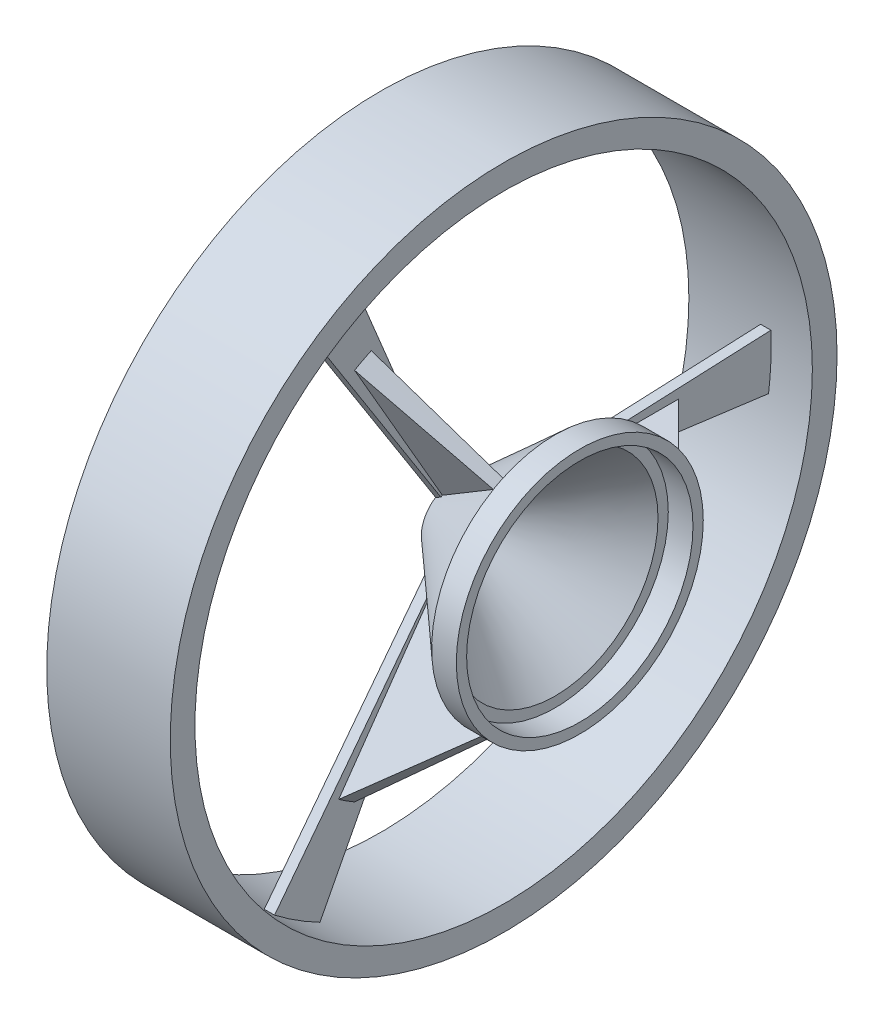
ISO-10303-21;
HEADER;
FILE_DESCRIPTION(('STEP AP214'),'2;1');
FILE_NAME('part.step','',(''),(''),'','','');
FILE_SCHEMA(('AUTOMOTIVE_DESIGN { 1 0 10303 214 1 1 1 1 }'));
ENDSEC;
DATA;
#1=APPLICATION_CONTEXT('core data for automotive mechanical design processes');
#2=APPLICATION_PROTOCOL_DEFINITION('international standard','automotive_design',2000,#1);
#3=PRODUCT_CONTEXT('',#1,'mechanical');
#4=PRODUCT('Part','Part','',(#3));
#5=PRODUCT_RELATED_PRODUCT_CATEGORY('part','',(#4));
#6=PRODUCT_DEFINITION_FORMATION('','',#4);
#7=PRODUCT_DEFINITION_CONTEXT('part definition',#1,'design');
#8=PRODUCT_DEFINITION('design','',#6,#7);
#9=PRODUCT_DEFINITION_SHAPE('','',#8);
#10=(LENGTH_UNIT() NAMED_UNIT(*) SI_UNIT(.MILLI.,.METRE.));
#11=(NAMED_UNIT(*) PLANE_ANGLE_UNIT() SI_UNIT($,.RADIAN.));
#12=(NAMED_UNIT(*) SI_UNIT($,.STERADIAN.) SOLID_ANGLE_UNIT());
#13=UNCERTAINTY_MEASURE_WITH_UNIT(LENGTH_MEASURE(1.E-05),#10,'distance_accuracy_value','');
#14=(GEOMETRIC_REPRESENTATION_CONTEXT(3) GLOBAL_UNCERTAINTY_ASSIGNED_CONTEXT((#13)) GLOBAL_UNIT_ASSIGNED_CONTEXT((#10,
#11,#12)) REPRESENTATION_CONTEXT('',''));
#15=CARTESIAN_POINT('',(0.,0.,0.));
#16=DIRECTION('',(0.,0.,1.));
#17=DIRECTION('',(1.,0.,0.));
#18=AXIS2_PLACEMENT_3D('',#15,#16,#17);
#19=CARTESIAN_POINT('',(-6.00000000000001,0.,2.22044604925031E-13));
#20=DIRECTION('',(1.,0.,0.));
#21=DIRECTION('',(0.,0.,-1.));
#22=AXIS2_PLACEMENT_3D('',#19,#20,#21);
#23=CONICAL_SURFACE('',#22,30.0000000000003,0.732815101786509);
#24=CARTESIAN_POINT('',(-31.,0.,2.22044604925031E-13));
#25=DIRECTION('',(-1.,0.,0.));
#26=DIRECTION('',(0.,0.,1.));
#27=AXIS2_PLACEMENT_3D('',#24,#25,#26);
#28=CIRCLE('',#27,7.50000000000019);
#29=CARTESIAN_POINT('',(-31.,6.92909649383467,2.87012574273806));
#30=VERTEX_POINT('',#29);
#31=CARTESIAN_POINT('',(-31.,0.327145405240019,-7.4928616618639));
#32=VERTEX_POINT('',#31);
#33=EDGE_CURVE('E251',#30,#32,#28,.T.);
#34=ORIENTED_EDGE('',*,*,#33,.F.);
#35=DIRECTION('',(0.743294146247166,0.61804282351789,0.256001719628465));
#36=VECTOR('',#35,1.);
#37=CARTESIAN_POINT('',(-31.,6.92909649383467,2.87012574273806));
#38=LINE('',#37,#36);
#39=CARTESIAN_POINT('',(-28.5,9.00782544198507,3.73116346555949));
#40=VERTEX_POINT('',#39);
#41=EDGE_CURVE('E392',#30,#40,#38,.T.);
#42=ORIENTED_EDGE('',*,*,#41,.T.);
#43=CARTESIAN_POINT('',(-28.5,-1.92296268638357E-13,-1.11022302462514E-13));
#44=DIRECTION('',(1.,0.,0.));
#45=DIRECTION('',(0.,0.866025403784443,0.499999999999992));
#46=AXIS2_PLACEMENT_3D('',#43,#44,#45);
#47=CIRCLE('',#46,9.75000000000019);
#48=CARTESIAN_POINT('',(-28.5,8.83650092360735,4.12052805197172));
#49=VERTEX_POINT('',#48);
#50=EDGE_CURVE('E359',#40,#49,#47,.T.);
#51=ORIENTED_EDGE('',*,*,#50,.T.);
#52=DIRECTION('',(0.743294146247165,0.606287945522313,0.282716712044108));
#53=VECTOR('',#52,1.);
#54=CARTESIAN_POINT('',(-6.,27.1892336110997,12.6785478522208));
#55=LINE('',#54,#53);
#56=CARTESIAN_POINT('',(-6.,27.1892336110997,12.6785478522208));
#57=VERTEX_POINT('',#56);
#58=EDGE_CURVE('E54',#49,#57,#55,.T.);
#59=ORIENTED_EDGE('',*,*,#58,.T.);
#60=CARTESIAN_POINT('',(-6.,-4.85722573273506E-13,2.22044604925031E-13));
#61=DIRECTION('',(-1.,0.,0.));
#62=DIRECTION('',(0.,0.,1.));
#63=AXIS2_PLACEMENT_3D('',#60,#61,#62);
#64=CIRCLE('',#63,30.0000000000003);
#65=CARTESIAN_POINT('',(-6.,0.,-30.0000000000001));
#66=VERTEX_POINT('',#65);
#67=EDGE_CURVE('E61',#57,#66,#64,.T.);
#68=ORIENTED_EDGE('',*,*,#67,.T.);
#69=DIRECTION('',(0.743294146247165,0.,-0.668964731622451));
#70=VECTOR('',#69,1.);
#71=CARTESIAN_POINT('',(-6.,0.,-30.0000000000001));
#72=LINE('',#71,#70);
#73=CARTESIAN_POINT('',(-28.5,0.,-9.74999999999997));
#74=VERTEX_POINT('',#73);
#75=EDGE_CURVE('E459',#74,#66,#72,.T.);
#76=ORIENTED_EDGE('',*,*,#75,.F.);
#77=CARTESIAN_POINT('',(-28.5,0.,2.22044604925031E-13));
#78=DIRECTION('',(1.,0.,0.));
#79=DIRECTION('',(0.,0.,-1.));
#80=AXIS2_PLACEMENT_3D('',#77,#78,#79);
#81=CIRCLE('',#80,9.75000000000019);
#82=CARTESIAN_POINT('',(-28.5,0.425289026812025,-9.74072016042308));
#83=VERTEX_POINT('',#82);
#84=EDGE_CURVE('E212',#74,#83,#81,.T.);
#85=ORIENTED_EDGE('',*,*,#84,.T.);
#86=DIRECTION('',(0.743294146247166,0.0291798317623878,-0.668328025428394));
#87=VECTOR('',#86,1.);
#88=CARTESIAN_POINT('',(-31.,0.32714540524002,-7.49286166186391));
#89=LINE('',#88,#87);
#90=EDGE_CURVE('E217',#32,#83,#89,.T.);
#91=ORIENTED_EDGE('',*,*,#90,.F.);
#92=EDGE_LOOP('',(#34,#42,#51,#59,#68,#76,#85,#91));
#93=FACE_BOUND('',#92,.T.);
#94=ADVANCED_FACE('F45',(#93),#23,.T.);
#95=CARTESIAN_POINT('',(-6.,0.,0.));
#96=DIRECTION('',(-1.,0.,0.));
#97=DIRECTION('',(0.,-0.866025403784443,-0.499999999999992));
#98=AXIS2_PLACEMENT_3D('',#95,#96,#97);
#99=CONICAL_SURFACE('',#98,30.0000000000001,0.783748034172808);
#100=DIRECTION('',(-0.708272635521935,0.639798014188676,0.298342713688533));
#101=VECTOR('',#100,1.);
#102=CARTESIAN_POINT('',(-31.,49.7722751582718,23.2091930700994));
#103=LINE('',#102,#101);
#104=CARTESIAN_POINT('',(-28.5,47.5139710035546,22.1561285483115));
#105=VERTEX_POINT('',#104);
#106=EDGE_CURVE('E418',#57,#105,#103,.T.);
#107=ORIENTED_EDGE('',*,*,#106,.T.);
#108=CARTESIAN_POINT('',(-28.5,0.,0.));
#109=DIRECTION('',(1.,0.,0.));
#110=DIRECTION('',(0.,0.866025403784443,0.499999999999992));
#111=AXIS2_PLACEMENT_3D('',#108,#109,#110);
#112=CIRCLE('',#111,52.425866447546);
#113=CARTESIAN_POINT('',(-28.5,45.4021321589853,26.2129332237726));
#114=VERTEX_POINT('',#113);
#115=EDGE_CURVE('E353',#105,#114,#112,.T.);
#116=ORIENTED_EDGE('',*,*,#115,.T.);
#117=DIRECTION('',(-0.708272635521935,0.611361108779511,0.352969500725911));
#118=VECTOR('',#117,1.);
#119=CARTESIAN_POINT('',(-31.,47.5600621640355,27.4588146930807));
#120=LINE('',#119,#118);
#121=CARTESIAN_POINT('',(-6.,25.9807621135334,14.9999999999998));
#122=VERTEX_POINT('',#121);
#123=EDGE_CURVE('E410',#122,#114,#120,.T.);
#124=ORIENTED_EDGE('',*,*,#123,.F.);
#125=CARTESIAN_POINT('',(-6.,0.,-5.31670390108921E-13));
#126=DIRECTION('',(-1.,0.,0.));
#127=DIRECTION('',(0.,-0.866025403784443,-0.499999999999992));
#128=AXIS2_PLACEMENT_3D('',#125,#126,#127);
#129=CIRCLE('',#128,30.0000000000003);
#130=EDGE_CURVE('E11',#122,#57,#129,.T.);
#131=ORIENTED_EDGE('',*,*,#130,.T.);
#132=EDGE_LOOP('',(#107,#116,#124,#131));
#133=FACE_BOUND('',#132,.T.);
#134=ADVANCED_FACE('F47',(#133),#99,.T.);
#135=CARTESIAN_POINT('',(0.,0.,0.));
#136=DIRECTION('',(0.,-0.422618261740691,0.906307787036654));
#137=DIRECTION('',(0.,-0.906307787036654,-0.422618261740691));
#138=AXIS2_PLACEMENT_3D('',#135,#136,#137);
#139=PLANE('',#138);
#140=DIRECTION('',(0.,-0.906307787036654,-0.422618261740691));
#141=VECTOR('',#140,1.);
#142=CARTESIAN_POINT('',(-28.5,8.82809053273636,4.11660622230051));
#143=LINE('',#142,#141);
#144=EDGE_CURVE('E356',#105,#49,#143,.T.);
#145=ORIENTED_EDGE('',*,*,#144,.F.);
#146=ORIENTED_EDGE('',*,*,#106,.F.);
#147=ORIENTED_EDGE('',*,*,#58,.F.);
#148=EDGE_LOOP('',(#145,#146,#147));
#149=FACE_BOUND('',#148,.T.);
#150=ADVANCED_FACE('F506',(#149),#139,.F.);
#151=CARTESIAN_POINT('',(0.,0.,0.));
#152=DIRECTION('',(0.,-0.499999999999992,0.866025403784443));
#153=DIRECTION('',(0.,-0.866025403784443,-0.499999999999992));
#154=AXIS2_PLACEMENT_3D('',#151,#152,#153);
#155=PLANE('',#154);
#156=ORIENTED_EDGE('',*,*,#123,.T.);
#157=DIRECTION('',(0.,-0.866025403784443,-0.499999999999992));
#158=VECTOR('',#157,1.);
#159=CARTESIAN_POINT('',(-28.5,8.37151025491231,4.83329369919723));
#160=LINE('',#159,#158);
#161=CARTESIAN_POINT('',(-28.5,8.4437476868983,4.87499999999991));
#162=VERTEX_POINT('',#161);
#163=EDGE_CURVE('E376',#114,#162,#160,.T.);
#164=ORIENTED_EDGE('',*,*,#163,.T.);
#165=DIRECTION('',(0.743294146247165,0.579340451820885,0.33448236581122));
#166=VECTOR('',#165,1.);
#167=CARTESIAN_POINT('',(-6.,25.9807621135334,14.9999999999998));
#168=LINE('',#167,#166);
#169=EDGE_CURVE('E414',#162,#122,#168,.T.);
#170=ORIENTED_EDGE('',*,*,#169,.T.);
#171=EDGE_LOOP('',(#156,#164,#170));
#172=FACE_BOUND('',#171,.T.);
#173=ADVANCED_FACE('F557',(#172),#155,.T.);
#174=CARTESIAN_POINT('',(-31.,69.2909649383468,28.701257427381));
#175=DIRECTION('',(-1.,0.,0.));
#176=DIRECTION('',(0.,-0.866025403784443,-0.499999999999992));
#177=AXIS2_PLACEMENT_3D('',#174,#175,#176);
#178=PLANE('',#177);
#179=DIRECTION('',(0.,-0.923879532511291,-0.382683432365081));
#180=VECTOR('',#179,1.);
#181=CARTESIAN_POINT('',(-31.,69.2909649383468,28.701257427381));
#182=LINE('',#181,#180);
#183=CARTESIAN_POINT('',(-31.,69.2909649383469,28.7012574273811));
#184=VERTEX_POINT('',#183);
#185=EDGE_CURVE('E396',#184,#30,#182,.T.);
#186=ORIENTED_EDGE('',*,*,#185,.T.);
#187=CARTESIAN_POINT('',(-31.,-1.92296268638357E-13,-1.11022302462514E-13));
#188=DIRECTION('',(-1.,0.,0.));
#189=DIRECTION('',(0.,-0.866025403784443,-0.499999999999992));
#190=AXIS2_PLACEMENT_3D('',#187,#188,#189);
#191=CIRCLE('',#190,7.50000000000019);
#192=CARTESIAN_POINT('',(-31.,6.32543584359665,4.0297470626011));
#193=VERTEX_POINT('',#192);
#194=EDGE_CURVE('E403',#193,#30,#191,.T.);
#195=ORIENTED_EDGE('',*,*,#194,.F.);
#196=DIRECTION('',(0.,-0.843391445812891,-0.537299608346816));
#197=VECTOR('',#196,1.);
#198=CARTESIAN_POINT('',(-31.,63.2543584359668,40.2974706260112));
#199=LINE('',#198,#197);
#200=CARTESIAN_POINT('',(-31.,63.2543584359669,40.2974706260113));
#201=VERTEX_POINT('',#200);
#202=EDGE_CURVE('E388',#201,#193,#199,.T.);
#203=ORIENTED_EDGE('',*,*,#202,.F.);
#204=CARTESIAN_POINT('',(-31.,-1.92296268638357E-13,-1.11022302462514E-13));
#205=DIRECTION('',(1.,0.,0.));
#206=DIRECTION('',(0.,0.866025403784443,0.499999999999992));
#207=AXIS2_PLACEMENT_3D('',#204,#205,#206);
#208=CIRCLE('',#207,75.0000000000002);
#209=EDGE_CURVE('E407',#184,#201,#208,.T.);
#210=ORIENTED_EDGE('',*,*,#209,.F.);
#211=EDGE_LOOP('',(#186,#195,#203,#210));
#212=FACE_BOUND('',#211,.T.);
#213=ADVANCED_FACE('F553',(#212),#178,.T.);
#214=CARTESIAN_POINT('',(0.,0.,0.));
#215=DIRECTION('',(0.,-0.382683432365081,0.92387953251129));
#216=DIRECTION('',(0.,-0.923879532511291,-0.382683432365081));
#217=AXIS2_PLACEMENT_3D('',#214,#215,#216);
#218=PLANE('',#217);
#219=ORIENTED_EDGE('',*,*,#41,.F.);
#220=ORIENTED_EDGE('',*,*,#185,.F.);
#221=DIRECTION('',(-1.,0.,0.));
#222=VECTOR('',#221,1.);
#223=CARTESIAN_POINT('',(-28.5,69.2909649383468,28.701257427381));
#224=LINE('',#223,#222);
#225=CARTESIAN_POINT('',(-28.5,69.2909649383469,28.7012574273811));
#226=VERTEX_POINT('',#225);
#227=EDGE_CURVE('E400',#226,#184,#224,.T.);
#228=ORIENTED_EDGE('',*,*,#227,.F.);
#229=DIRECTION('',(0.,0.923879532511291,0.382683432365081));
#230=VECTOR('',#229,1.);
#231=CARTESIAN_POINT('',(-28.5,9.00782544198507,3.73116346555949));
#232=LINE('',#231,#230);
#233=EDGE_CURVE('E363',#40,#226,#232,.T.);
#234=ORIENTED_EDGE('',*,*,#233,.F.);
#235=EDGE_LOOP('',(#219,#220,#228,#234));
#236=FACE_BOUND('',#235,.T.);
#237=ADVANCED_FACE('F549',(#236),#218,.F.);
#238=CARTESIAN_POINT('',(0.,0.,0.));
#239=DIRECTION('',(0.,-0.537299608346816,0.84339144581289));
#240=DIRECTION('',(0.,-0.843391445812891,-0.537299608346816));
#241=AXIS2_PLACEMENT_3D('',#238,#239,#240);
#242=PLANE('',#241);
#243=DIRECTION('',(0.743294146247166,0.564199132200891,0.359434488298575));
#244=VECTOR('',#243,1.);
#245=CARTESIAN_POINT('',(-31.,6.32543584359666,4.02974706260111));
#246=LINE('',#245,#244);
#247=CARTESIAN_POINT('',(-28.5,8.22306659667565,5.23867118138144));
#248=VERTEX_POINT('',#247);
#249=EDGE_CURVE('E380',#193,#248,#246,.T.);
#250=ORIENTED_EDGE('',*,*,#249,.T.);
#251=DIRECTION('',(0.,0.843391445812891,0.537299608346816));
#252=VECTOR('',#251,1.);
#253=CARTESIAN_POINT('',(-28.5,8.22306659667565,5.23867118138144));
#254=LINE('',#253,#252);
#255=CARTESIAN_POINT('',(-28.5,63.2543584359668,40.2974706260112));
#256=VERTEX_POINT('',#255);
#257=EDGE_CURVE('E372',#248,#256,#254,.T.);
#258=ORIENTED_EDGE('',*,*,#257,.T.);
#259=DIRECTION('',(-1.,0.,0.));
#260=VECTOR('',#259,1.);
#261=CARTESIAN_POINT('',(-28.5,63.2543584359668,40.2974706260112));
#262=LINE('',#261,#260);
#263=EDGE_CURVE('E384',#256,#201,#262,.T.);
#264=ORIENTED_EDGE('',*,*,#263,.T.);
#265=ORIENTED_EDGE('',*,*,#202,.T.);
#266=EDGE_LOOP('',(#250,#258,#264,#265));
#267=FACE_BOUND('',#266,.T.);
#268=ADVANCED_FACE('F545',(#267),#242,.T.);
#269=CARTESIAN_POINT('',(-28.5,9.00782544198507,3.73116346555949));
#270=DIRECTION('',(1.,0.,0.));
#271=DIRECTION('',(0.,0.866025403784443,0.499999999999992));
#272=AXIS2_PLACEMENT_3D('',#269,#270,#271);
#273=PLANE('',#272);
#274=ORIENTED_EDGE('',*,*,#115,.F.);
#275=ORIENTED_EDGE('',*,*,#144,.T.);
#276=ORIENTED_EDGE('',*,*,#50,.F.);
#277=ORIENTED_EDGE('',*,*,#233,.T.);
#278=CARTESIAN_POINT('',(-28.5,-1.92296268638357E-13,-1.11022302462514E-13));
#279=DIRECTION('',(1.,0.,0.));
#280=DIRECTION('',(0.,0.866025403784443,0.499999999999992));
#281=AXIS2_PLACEMENT_3D('',#278,#279,#280);
#282=CIRCLE('',#281,75.0000000000002);
#283=EDGE_CURVE('E368',#226,#256,#282,.T.);
#284=ORIENTED_EDGE('',*,*,#283,.T.);
#285=ORIENTED_EDGE('',*,*,#257,.F.);
#286=EDGE_CURVE('E364',#162,#248,#47,.T.);
#287=ORIENTED_EDGE('',*,*,#286,.F.);
#288=ORIENTED_EDGE('',*,*,#163,.F.);
#289=EDGE_LOOP('',(#274,#275,#276,#277,#284,#285,#287,#288));
#290=FACE_BOUND('',#289,.T.);
#291=ADVANCED_FACE('F510',(#290),#273,.T.);
#292=CARTESIAN_POINT('',(-31.,-5.9501500521842,4.56571071756545));
#293=VERTEX_POINT('',#292);
#294=EDGE_CURVE('E272',#293,#193,#28,.T.);
#295=ORIENTED_EDGE('',*,*,#294,.F.);
#296=DIRECTION('',(0.743294146247166,-0.530725404369699,0.407239925978921));
#297=VECTOR('',#296,1.);
#298=CARTESIAN_POINT('',(-31.,-5.9501500521842,4.56571071756545));
#299=LINE('',#298,#297);
#300=CARTESIAN_POINT('',(-28.5,-7.73519506783947,5.93542393283508));
#301=VERTEX_POINT('',#300);
#302=EDGE_CURVE('E316',#293,#301,#299,.T.);
#303=ORIENTED_EDGE('',*,*,#302,.T.);
#304=CARTESIAN_POINT('',(-28.5,1.92296268638356E-13,-1.11022302462517E-13));
#305=DIRECTION('',(1.,0.,0.));
#306=DIRECTION('',(0.,-0.866025403784436,0.500000000000004));
#307=AXIS2_PLACEMENT_3D('',#304,#305,#306);
#308=CIRCLE('',#307,9.75000000000019);
#309=CARTESIAN_POINT('',(-28.5,-7.98673243181762,5.59237025442272));
#310=VERTEX_POINT('',#309);
#311=EDGE_CURVE('E283',#301,#310,#308,.T.);
#312=ORIENTED_EDGE('',*,*,#311,.T.);
#313=DIRECTION('',(0.743294146247165,-0.547983827465766,0.383702406808542));
#314=VECTOR('',#313,1.);
#315=CARTESIAN_POINT('',(-6.,-24.5745613286697,17.2072930905316));
#316=LINE('',#315,#314);
#317=CARTESIAN_POINT('',(-6.,-24.5745613286698,17.2072930905316));
#318=VERTEX_POINT('',#317);
#319=EDGE_CURVE('E346',#310,#318,#316,.T.);
#320=ORIENTED_EDGE('',*,*,#319,.T.);
#321=EDGE_CURVE('E69',#318,#122,#64,.T.);
#322=ORIENTED_EDGE('',*,*,#321,.T.);
#323=ORIENTED_EDGE('',*,*,#169,.F.);
#324=ORIENTED_EDGE('',*,*,#286,.T.);
#325=ORIENTED_EDGE('',*,*,#249,.F.);
#326=EDGE_LOOP('',(#295,#303,#312,#320,#322,#323,#324,#325));
#327=FACE_BOUND('',#326,.T.);
#328=ADVANCED_FACE('F440',(#327),#23,.T.);
#329=CARTESIAN_POINT('',(-6.,0.,0.));
#330=DIRECTION('',(-1.,0.,0.));
#331=DIRECTION('',(0.,0.866025403784436,-0.500000000000004));
#332=AXIS2_PLACEMENT_3D('',#329,#330,#331);
#333=CONICAL_SURFACE('',#332,30.0000000000001,0.783748034172808);
#334=DIRECTION('',(-0.708272635521935,-0.578271376182597,0.404909976733962));
#335=VECTOR('',#334,1.);
#336=CARTESIAN_POINT('',(-31.,-44.9858883791798,31.4994581561626));
#337=LINE('',#336,#335);
#338=CARTESIAN_POINT('',(-28.5,-42.9447556741288,30.0702416495995));
#339=VERTEX_POINT('',#338);
#340=EDGE_CURVE('E342',#318,#339,#337,.T.);
#341=ORIENTED_EDGE('',*,*,#340,.T.);
#342=CARTESIAN_POINT('',(-28.5,0.,0.));
#343=DIRECTION('',(1.,0.,0.));
#344=DIRECTION('',(0.,-0.866025403784436,0.500000000000004));
#345=AXIS2_PLACEMENT_3D('',#342,#343,#344);
#346=CIRCLE('',#345,52.425866447546);
#347=CARTESIAN_POINT('',(-28.5,-45.402132158985,26.2129332237732));
#348=VERTEX_POINT('',#347);
#349=EDGE_CURVE('E277',#339,#348,#346,.T.);
#350=ORIENTED_EDGE('',*,*,#349,.T.);
#351=DIRECTION('',(-0.708272635521935,-0.611361108779506,0.35296950072592));
#352=VECTOR('',#351,1.);
#353=CARTESIAN_POINT('',(-31.,-47.5600621640351,27.4588146930813));
#354=LINE('',#353,#352);
#355=CARTESIAN_POINT('',(-6.,-25.9807621135332,15.0000000000002));
#356=VERTEX_POINT('',#355);
#357=EDGE_CURVE('E334',#356,#348,#354,.T.);
#358=ORIENTED_EDGE('',*,*,#357,.F.);
#359=CARTESIAN_POINT('',(-6.,4.35157555275111E-13,3.09625785183887E-13));
#360=DIRECTION('',(-1.,0.,0.));
#361=DIRECTION('',(0.,0.866025403784436,-0.500000000000004));
#362=AXIS2_PLACEMENT_3D('',#359,#360,#361);
#363=CIRCLE('',#362,30.0000000000003);
#364=EDGE_CURVE('E349',#356,#318,#363,.T.);
#365=ORIENTED_EDGE('',*,*,#364,.T.);
#366=EDGE_LOOP('',(#341,#350,#358,#365));
#367=FACE_BOUND('',#366,.T.);
#368=ADVANCED_FACE('F442',(#367),#333,.T.);
#369=CARTESIAN_POINT('',(0.,0.,0.));
#370=DIRECTION('',(0.,-0.57357643635105,-0.819152044288989));
#371=DIRECTION('',(0.,0.819152044288989,-0.57357643635105));
#372=AXIS2_PLACEMENT_3D('',#369,#370,#371);
#373=PLANE('',#372);
#374=DIRECTION('',(0.,0.819152044288989,-0.57357643635105));
#375=VECTOR('',#374,1.);
#376=CARTESIAN_POINT('',(-28.5,-7.97913083225754,5.5870475571083));
#377=LINE('',#376,#375);
#378=EDGE_CURVE('E280',#339,#310,#377,.T.);
#379=ORIENTED_EDGE('',*,*,#378,.F.);
#380=ORIENTED_EDGE('',*,*,#340,.F.);
#381=ORIENTED_EDGE('',*,*,#319,.F.);
#382=EDGE_LOOP('',(#379,#380,#381));
#383=FACE_BOUND('',#382,.T.);
#384=ADVANCED_FACE('F438',(#383),#373,.F.);
#385=CARTESIAN_POINT('',(0.,0.,0.));
#386=DIRECTION('',(0.,-0.500000000000004,-0.866025403784436));
#387=DIRECTION('',(0.,0.866025403784436,-0.500000000000004));
#388=AXIS2_PLACEMENT_3D('',#385,#386,#387);
#389=PLANE('',#388);
#390=ORIENTED_EDGE('',*,*,#357,.T.);
#391=DIRECTION('',(0.,0.866025403784436,-0.500000000000004));
#392=VECTOR('',#391,1.);
#393=CARTESIAN_POINT('',(-28.5,-8.37151025491224,4.83329369919735));
#394=LINE('',#393,#392);
#395=CARTESIAN_POINT('',(-28.5,-8.44374768689823,4.87500000000002));
#396=VERTEX_POINT('',#395);
#397=EDGE_CURVE('E300',#348,#396,#394,.T.);
#398=ORIENTED_EDGE('',*,*,#397,.T.);
#399=DIRECTION('',(0.743294146247165,-0.579340451820881,0.334482365811228));
#400=VECTOR('',#399,1.);
#401=CARTESIAN_POINT('',(-6.,-25.9807621135332,15.0000000000002));
#402=LINE('',#401,#400);
#403=EDGE_CURVE('E338',#396,#356,#402,.T.);
#404=ORIENTED_EDGE('',*,*,#403,.T.);
#405=EDGE_LOOP('',(#390,#398,#404));
#406=FACE_BOUND('',#405,.T.);
#407=ADVANCED_FACE('F446',(#406),#389,.T.);
#408=CARTESIAN_POINT('',(-31.,-59.5015005218424,45.6571071756544));
#409=DIRECTION('',(-1.,0.,0.));
#410=DIRECTION('',(0.,0.866025403784436,-0.500000000000004));
#411=AXIS2_PLACEMENT_3D('',#408,#409,#410);
#412=PLANE('',#411);
#413=DIRECTION('',(0.,0.793353340291232,-0.608761429008725));
#414=VECTOR('',#413,1.);
#415=CARTESIAN_POINT('',(-31.,-59.5015005218424,45.6571071756544));
#416=LINE('',#415,#414);
#417=CARTESIAN_POINT('',(-31.,-59.5015005218425,45.6571071756545));
#418=VERTEX_POINT('',#417);
#419=EDGE_CURVE('E320',#418,#293,#416,.T.);
#420=ORIENTED_EDGE('',*,*,#419,.T.);
#421=CARTESIAN_POINT('',(-31.,1.92296268638356E-13,-1.11022302462517E-13));
#422=DIRECTION('',(-1.,0.,0.));
#423=DIRECTION('',(0.,0.866025403784436,-0.500000000000004));
#424=AXIS2_PLACEMENT_3D('',#421,#422,#423);
#425=CIRCLE('',#424,7.50000000000019);
#426=CARTESIAN_POINT('',(-31.,-6.65258124883662,3.46311459926277));
#427=VERTEX_POINT('',#426);
#428=EDGE_CURVE('E327',#427,#293,#425,.T.);
#429=ORIENTED_EDGE('',*,*,#428,.F.);
#430=DIRECTION('',(0.,0.88701083317822,-0.461748613235038));
#431=VECTOR('',#430,1.);
#432=CARTESIAN_POINT('',(-31.,-66.5258124883665,34.6311459926279));
#433=LINE('',#432,#431);
#434=CARTESIAN_POINT('',(-31.,-66.5258124883666,34.6311459926279));
#435=VERTEX_POINT('',#434);
#436=EDGE_CURVE('E312',#435,#427,#433,.T.);
#437=ORIENTED_EDGE('',*,*,#436,.F.);
#438=CARTESIAN_POINT('',(-31.,1.92296268638356E-13,-1.11022302462517E-13));
#439=DIRECTION('',(1.,0.,0.));
#440=DIRECTION('',(0.,-0.866025403784436,0.500000000000004));
#441=AXIS2_PLACEMENT_3D('',#438,#439,#440);
#442=CIRCLE('',#441,75.0000000000002);
#443=EDGE_CURVE('E331',#418,#435,#442,.T.);
#444=ORIENTED_EDGE('',*,*,#443,.F.);
#445=EDGE_LOOP('',(#420,#429,#437,#444));
#446=FACE_BOUND('',#445,.T.);
#447=ADVANCED_FACE('F532',(#446),#412,.T.);
#448=CARTESIAN_POINT('',(0.,0.,0.));
#449=DIRECTION('',(0.,-0.608761429008725,-0.793353340291232));
#450=DIRECTION('',(0.,0.793353340291232,-0.608761429008725));
#451=AXIS2_PLACEMENT_3D('',#448,#449,#450);
#452=PLANE('',#451);
#453=ORIENTED_EDGE('',*,*,#302,.F.);
#454=ORIENTED_EDGE('',*,*,#419,.F.);
#455=DIRECTION('',(-1.,0.,0.));
#456=VECTOR('',#455,1.);
#457=CARTESIAN_POINT('',(-28.5,-59.5015005218424,45.6571071756544));
#458=LINE('',#457,#456);
#459=CARTESIAN_POINT('',(-28.5,-59.5015005218425,45.6571071756545));
#460=VERTEX_POINT('',#459);
#461=EDGE_CURVE('E324',#460,#418,#458,.T.);
#462=ORIENTED_EDGE('',*,*,#461,.F.);
#463=DIRECTION('',(0.,-0.793353340291232,0.608761429008725));
#464=VECTOR('',#463,1.);
#465=CARTESIAN_POINT('',(-28.5,-7.73519506783947,5.93542393283508));
#466=LINE('',#465,#464);
#467=EDGE_CURVE('E287',#301,#460,#466,.T.);
#468=ORIENTED_EDGE('',*,*,#467,.F.);
#469=EDGE_LOOP('',(#453,#454,#462,#468));
#470=FACE_BOUND('',#469,.T.);
#471=ADVANCED_FACE('F524',(#470),#452,.F.);
#472=CARTESIAN_POINT('',(0.,0.,0.));
#473=DIRECTION('',(0.,-0.461748613235038,-0.88701083317822));
#474=DIRECTION('',(0.,0.88701083317822,-0.461748613235038));
#475=AXIS2_PLACEMENT_3D('',#472,#473,#474);
#476=PLANE('',#475);
#477=DIRECTION('',(0.743294146247166,-0.593378963963274,0.308893537129816));
#478=VECTOR('',#477,1.);
#479=CARTESIAN_POINT('',(-31.,-6.65258124883662,3.46311459926277));
#480=LINE('',#479,#478);
#481=CARTESIAN_POINT('',(-28.5,-8.64835562348761,4.5020489790416));
#482=VERTEX_POINT('',#481);
#483=EDGE_CURVE('E304',#427,#482,#480,.T.);
#484=ORIENTED_EDGE('',*,*,#483,.T.);
#485=DIRECTION('',(0.,-0.88701083317822,0.461748613235038));
#486=VECTOR('',#485,1.);
#487=CARTESIAN_POINT('',(-28.5,-8.64835562348761,4.5020489790416));
#488=LINE('',#487,#486);
#489=CARTESIAN_POINT('',(-28.5,-66.5258124883665,34.6311459926279));
#490=VERTEX_POINT('',#489);
#491=EDGE_CURVE('E296',#482,#490,#488,.T.);
#492=ORIENTED_EDGE('',*,*,#491,.T.);
#493=DIRECTION('',(-1.,0.,0.));
#494=VECTOR('',#493,1.);
#495=CARTESIAN_POINT('',(-28.5,-66.5258124883665,34.6311459926279));
#496=LINE('',#495,#494);
#497=EDGE_CURVE('E308',#490,#435,#496,.T.);
#498=ORIENTED_EDGE('',*,*,#497,.T.);
#499=ORIENTED_EDGE('',*,*,#436,.T.);
#500=EDGE_LOOP('',(#484,#492,#498,#499));
#501=FACE_BOUND('',#500,.T.);
#502=ADVANCED_FACE('F518',(#501),#476,.T.);
#503=CARTESIAN_POINT('',(-28.5,-7.73519506783947,5.93542393283508));
#504=DIRECTION('',(1.,0.,0.));
#505=DIRECTION('',(0.,-0.866025403784436,0.500000000000004));
#506=AXIS2_PLACEMENT_3D('',#503,#504,#505);
#507=PLANE('',#506);
#508=ORIENTED_EDGE('',*,*,#349,.F.);
#509=ORIENTED_EDGE('',*,*,#378,.T.);
#510=ORIENTED_EDGE('',*,*,#311,.F.);
#511=ORIENTED_EDGE('',*,*,#467,.T.);
#512=CARTESIAN_POINT('',(-28.5,1.92296268638356E-13,-1.11022302462517E-13));
#513=DIRECTION('',(1.,0.,0.));
#514=DIRECTION('',(0.,-0.866025403784436,0.500000000000004));
#515=AXIS2_PLACEMENT_3D('',#512,#513,#514);
#516=CIRCLE('',#515,75.0000000000002);
#517=EDGE_CURVE('E292',#460,#490,#516,.T.);
#518=ORIENTED_EDGE('',*,*,#517,.T.);
#519=ORIENTED_EDGE('',*,*,#491,.F.);
#520=EDGE_CURVE('E288',#396,#482,#308,.T.);
#521=ORIENTED_EDGE('',*,*,#520,.F.);
#522=ORIENTED_EDGE('',*,*,#397,.F.);
#523=EDGE_LOOP('',(#508,#509,#510,#511,#518,#519,#521,#522));
#524=FACE_BOUND('',#523,.T.);
#525=ADVANCED_FACE('F512',(#524),#507,.T.);
#526=CARTESIAN_POINT('',(-31.,-0.978946441650424,-7.43583646030355));
#527=VERTEX_POINT('',#526);
#528=EDGE_CURVE('E246',#527,#427,#28,.T.);
#529=ORIENTED_EDGE('',*,*,#528,.F.);
#530=DIRECTION('',(0.743294146247166,-0.0873174191481874,-0.663241645607389));
#531=VECTOR('',#530,1.);
#532=CARTESIAN_POINT('',(-31.,-0.978946441650424,-7.43583646030355));
#533=LINE('',#532,#531);
#534=CARTESIAN_POINT('',(-28.5,-1.27263037414554,-9.66658739839461));
#535=VERTEX_POINT('',#534);
#536=EDGE_CURVE('E227',#527,#535,#533,.T.);
#537=ORIENTED_EDGE('',*,*,#536,.T.);
#538=CARTESIAN_POINT('',(-28.5,-0.849768491789666,-9.71289830639449));
#539=VERTEX_POINT('',#538);
#540=EDGE_CURVE('E242',#535,#539,#81,.T.);
#541=ORIENTED_EDGE('',*,*,#540,.T.);
#542=DIRECTION('',(0.743294146247165,-0.0583041180565427,-0.666419118852653));
#543=VECTOR('',#542,1.);
#544=CARTESIAN_POINT('',(-6.,-2.61467228242976,-29.8858409427525));
#545=LINE('',#544,#543);
#546=CARTESIAN_POINT('',(-6.,-2.61467228242976,-29.8858409427525));
#547=VERTEX_POINT('',#546);
#548=EDGE_CURVE('E453',#539,#547,#545,.T.);
#549=ORIENTED_EDGE('',*,*,#548,.T.);
#550=EDGE_CURVE('E273',#547,#356,#64,.T.);
#551=ORIENTED_EDGE('',*,*,#550,.T.);
#552=ORIENTED_EDGE('',*,*,#403,.F.);
#553=ORIENTED_EDGE('',*,*,#520,.T.);
#554=ORIENTED_EDGE('',*,*,#483,.F.);
#555=EDGE_LOOP('',(#529,#537,#541,#549,#551,#552,#553,#554));
#556=FACE_BOUND('',#555,.T.);
#557=ADVANCED_FACE('F450',(#556),#23,.T.);
#558=CARTESIAN_POINT('',(-28.5,-1.27263037414554,-9.66658739839461));
#559=DIRECTION('',(1.,0.,0.));
#560=DIRECTION('',(0.,0.,-1.));
#561=AXIS2_PLACEMENT_3D('',#558,#559,#560);
#562=PLANE('',#561);
#563=CARTESIAN_POINT('',(-28.5,0.,0.));
#564=DIRECTION('',(1.,0.,0.));
#565=DIRECTION('',(0.,0.,-1.));
#566=AXIS2_PLACEMENT_3D('',#563,#564,#565);
#567=CIRCLE('',#566,52.425866447546);
#568=CARTESIAN_POINT('',(-28.5,-4.56921532942541,-52.2263701979113));
#569=VERTEX_POINT('',#568);
#570=CARTESIAN_POINT('',(-28.5,0.,-52.425866447546));
#571=VERTEX_POINT('',#570);
#572=EDGE_CURVE('E221',#569,#571,#567,.T.);
#573=ORIENTED_EDGE('',*,*,#572,.F.);
#574=DIRECTION('',(0.,0.0871557427476583,0.996194698091746));
#575=VECTOR('',#574,1.);
#576=CARTESIAN_POINT('',(-28.5,-0.848959700478763,-9.70365377940885));
#577=LINE('',#576,#575);
#578=EDGE_CURVE('E467',#569,#539,#577,.T.);
#579=ORIENTED_EDGE('',*,*,#578,.T.);
#580=ORIENTED_EDGE('',*,*,#540,.F.);
#581=DIRECTION('',(0.,-0.130526192220052,-0.99144486137381));
#582=VECTOR('',#581,1.);
#583=CARTESIAN_POINT('',(-28.5,-1.27263037414554,-9.66658739839461));
#584=LINE('',#583,#582);
#585=CARTESIAN_POINT('',(-28.5,-9.7894644165039,-74.3583646030356));
#586=VERTEX_POINT('',#585);
#587=EDGE_CURVE('E209',#535,#586,#584,.T.);
#588=ORIENTED_EDGE('',*,*,#587,.T.);
#589=CARTESIAN_POINT('',(-28.5,0.,2.22044604925031E-13));
#590=DIRECTION('',(1.,0.,0.));
#591=DIRECTION('',(0.,0.,-1.));
#592=AXIS2_PLACEMENT_3D('',#589,#590,#591);
#593=CIRCLE('',#592,75.0000000000002);
#594=CARTESIAN_POINT('',(-28.5,3.2714540524002,-74.9286166186391));
#595=VERTEX_POINT('',#594);
#596=EDGE_CURVE('E193',#586,#595,#593,.T.);
#597=ORIENTED_EDGE('',*,*,#596,.T.);
#598=DIRECTION('',(0.,0.0436193873653361,-0.999048221581858));
#599=VECTOR('',#598,1.);
#600=CARTESIAN_POINT('',(-28.5,0.425289026812025,-9.74072016042308));
#601=LINE('',#600,#599);
#602=EDGE_CURVE('E203',#83,#595,#601,.T.);
#603=ORIENTED_EDGE('',*,*,#602,.F.);
#604=ORIENTED_EDGE('',*,*,#84,.F.);
#605=DIRECTION('',(0.,0.,1.));
#606=VECTOR('',#605,1.);
#607=CARTESIAN_POINT('',(-28.5,0.,-9.66658739839461));
#608=LINE('',#607,#606);
#609=EDGE_CURVE('E461',#571,#74,#608,.T.);
#610=ORIENTED_EDGE('',*,*,#609,.F.);
#611=EDGE_LOOP('',(#573,#579,#580,#588,#597,#603,#604,#610));
#612=FACE_BOUND('',#611,.T.);
#613=ADVANCED_FACE('F207',(#612),#562,.T.);
#614=CARTESIAN_POINT('',(0.,-4.85722573273506E-13,2.22044604925031E-13));
#615=DIRECTION('',(-1.,0.,0.));
#616=DIRECTION('',(0.,0.,1.));
#617=AXIS2_PLACEMENT_3D('',#614,#615,#616);
#618=PLANE('',#617);
#619=CARTESIAN_POINT('',(0.,-4.85722573273506E-13,2.22044604925031E-13));
#620=DIRECTION('',(-1.,0.,0.));
#621=DIRECTION('',(0.,0.,1.));
#622=AXIS2_PLACEMENT_3D('',#619,#620,#621);
#623=CIRCLE('',#622,30.0000000000003);
#624=CARTESIAN_POINT('',(0.,-4.85722573273506E-13,30.0000000000005));
#625=VERTEX_POINT('',#624);
#626=EDGE_CURVE('E267',#625,#625,#623,.T.);
#627=ORIENTED_EDGE('',*,*,#626,.F.);
#628=EDGE_LOOP('',(#627));
#629=FACE_BOUND('',#628,.T.);
#630=CARTESIAN_POINT('',(0.,-4.85722573273506E-13,2.22044604925031E-13));
#631=DIRECTION('',(-1.,0.,0.));
#632=DIRECTION('',(0.,0.,1.));
#633=AXIS2_PLACEMENT_3D('',#630,#631,#632);
#634=CIRCLE('',#633,27.5000000000001);
#635=CARTESIAN_POINT('',(0.,-4.85722573273506E-13,27.5000000000003));
#636=VERTEX_POINT('',#635);
#637=EDGE_CURVE('E263',#636,#636,#634,.T.);
#638=ORIENTED_EDGE('',*,*,#637,.T.);
#639=EDGE_LOOP('',(#638));
#640=FACE_BOUND('',#639,.T.);
#641=ADVANCED_FACE('F517',(#629,#640),#618,.F.);
#642=CARTESIAN_POINT('',(-6.,-4.85722573273506E-13,2.22044604925031E-13));
#643=DIRECTION('',(1.,0.,0.));
#644=DIRECTION('',(0.,0.,-1.));
#645=AXIS2_PLACEMENT_3D('',#642,#643,#644);
#646=CYLINDRICAL_SURFACE('',#645,30.0000000000003);
#647=ORIENTED_EDGE('',*,*,#321,.F.);
#648=ORIENTED_EDGE('',*,*,#364,.F.);
#649=ORIENTED_EDGE('',*,*,#550,.F.);
#650=EDGE_CURVE('E268',#66,#547,#64,.T.);
#651=ORIENTED_EDGE('',*,*,#650,.F.);
#652=ORIENTED_EDGE('',*,*,#67,.F.);
#653=ORIENTED_EDGE('',*,*,#130,.F.);
#654=EDGE_LOOP('',(#647,#648,#649,#651,#652,#653));
#655=FACE_BOUND('',#654,.T.);
#656=ORIENTED_EDGE('',*,*,#626,.T.);
#657=EDGE_LOOP('',(#656));
#658=FACE_BOUND('',#657,.T.);
#659=ADVANCED_FACE('F429',(#655,#658),#646,.T.);
#660=CARTESIAN_POINT('',(-6.,-4.85722573273506E-13,2.22044604925031E-13));
#661=DIRECTION('',(1.,0.,0.));
#662=DIRECTION('',(0.,0.,-1.));
#663=AXIS2_PLACEMENT_3D('',#660,#661,#662);
#664=CYLINDRICAL_SURFACE('',#663,27.5000000000001);
#665=CARTESIAN_POINT('',(-6.,-4.85722573273506E-13,2.22044604925031E-13));
#666=DIRECTION('',(-1.,0.,0.));
#667=DIRECTION('',(0.,0.,1.));
#668=AXIS2_PLACEMENT_3D('',#665,#666,#667);
#669=CIRCLE('',#668,27.5000000000001);
#670=CARTESIAN_POINT('',(-6.,-4.85722573273506E-13,27.5000000000003));
#671=VERTEX_POINT('',#670);
#672=EDGE_CURVE('E259',#671,#671,#669,.T.);
#673=ORIENTED_EDGE('',*,*,#672,.T.);
#674=EDGE_LOOP('',(#673));
#675=FACE_BOUND('',#674,.T.);
#676=ORIENTED_EDGE('',*,*,#637,.F.);
#677=EDGE_LOOP('',(#676));
#678=FACE_BOUND('',#677,.T.);
#679=ADVANCED_FACE('F714',(#675,#678),#664,.F.);
#680=CARTESIAN_POINT('',(-6.,0.,-25.0000000000001));
#681=DIRECTION('',(-1.,0.,0.));
#682=DIRECTION('',(0.,0.,1.));
#683=AXIS2_PLACEMENT_3D('',#680,#681,#682);
#684=PLANE('',#683);
#685=CARTESIAN_POINT('',(-6.00000000000001,0.,2.22044604925031E-13));
#686=DIRECTION('',(-1.,0.,0.));
#687=DIRECTION('',(0.,0.,1.));
#688=AXIS2_PLACEMENT_3D('',#685,#686,#687);
#689=CIRCLE('',#688,25.0000000000003);
#690=CARTESIAN_POINT('',(-6.00000000000001,0.,-25.0000000000001));
#691=VERTEX_POINT('',#690);
#692=EDGE_CURVE('E255',#691,#691,#689,.T.);
#693=ORIENTED_EDGE('',*,*,#692,.T.);
#694=EDGE_LOOP('',(#693));
#695=FACE_BOUND('',#694,.T.);
#696=ORIENTED_EDGE('',*,*,#672,.F.);
#697=EDGE_LOOP('',(#696));
#698=FACE_BOUND('',#697,.T.);
#699=ADVANCED_FACE('F795',(#695,#698),#684,.F.);
#700=CARTESIAN_POINT('',(-25.4444444444445,0.,2.22044604925031E-13));
#701=DIRECTION('',(1.,0.,0.));
#702=DIRECTION('',(0.,0.,-1.));
#703=AXIS2_PLACEMENT_3D('',#700,#701,#702);
#704=CONICAL_SURFACE('',#703,7.50000000000019,0.732815101786509);
#705=CARTESIAN_POINT('',(-25.4444444444445,0.,2.22044604925031E-13));
#706=DIRECTION('',(-1.,0.,0.));
#707=DIRECTION('',(0.,0.,1.));
#708=AXIS2_PLACEMENT_3D('',#705,#706,#707);
#709=CIRCLE('',#708,7.50000000000019);
#710=CARTESIAN_POINT('',(-25.4444444444445,0.,-7.49999999999997));
#711=VERTEX_POINT('',#710);
#712=EDGE_CURVE('E250',#711,#711,#709,.T.);
#713=CARTESIAN_POINT('',(-6.00000000000001,0.,-25.0000000000001));
#714=CARTESIAN_POINT('',(-6.2025462962963,0.,-24.8177083333334));
#715=CARTESIAN_POINT('',(-6.4050925925926,0.,-24.6354166666667));
#716=CARTESIAN_POINT('',(-6.81018518518519,0.,-24.2708333333334));
#717=CARTESIAN_POINT('',(-7.01273148148149,0.,-24.0885416666667));
#718=CARTESIAN_POINT('',(-7.41782407407408,0.,-23.7239583333334));
#719=CARTESIAN_POINT('',(-7.62037037037038,0.,-23.5416666666667));
#720=CARTESIAN_POINT('',(-8.02546296296297,0.,-23.1770833333334));
#721=CARTESIAN_POINT('',(-8.22800925925927,0.,-22.9947916666667));
#722=CARTESIAN_POINT('',(-8.63310185185186,0.,-22.6302083333334));
#723=CARTESIAN_POINT('',(-8.83564814814816,0.,-22.4479166666667));
#724=CARTESIAN_POINT('',(-9.24074074074075,0.,-22.0833333333334));
#725=CARTESIAN_POINT('',(-9.44328703703705,0.,-21.9010416666667));
#726=CARTESIAN_POINT('',(-9.84837962962964,0.,-21.5364583333334));
#727=CARTESIAN_POINT('',(-10.0509259259259,0.,-21.3541666666667));
#728=CARTESIAN_POINT('',(-10.4560185185185,0.,-20.9895833333334));
#729=CARTESIAN_POINT('',(-10.6585648148148,0.,-20.8072916666667));
#730=CARTESIAN_POINT('',(-11.0636574074074,0.,-20.4427083333334));
#731=CARTESIAN_POINT('',(-11.2662037037037,0.,-20.2604166666667));
#732=CARTESIAN_POINT('',(-11.6712962962963,0.,-19.8958333333334));
#733=CARTESIAN_POINT('',(-11.8738425925926,0.,-19.7135416666667));
#734=CARTESIAN_POINT('',(-12.2789351851852,0.,-19.3489583333334));
#735=CARTESIAN_POINT('',(-12.4814814814815,0.,-19.1666666666667));
#736=CARTESIAN_POINT('',(-12.8865740740741,0.,-18.8020833333334));
#737=CARTESIAN_POINT('',(-13.0891203703704,0.,-18.6197916666667));
#738=CARTESIAN_POINT('',(-13.494212962963,0.,-18.2552083333334));
#739=CARTESIAN_POINT('',(-13.6967592592593,0.,-18.0729166666667));
#740=CARTESIAN_POINT('',(-14.1018518518519,0.,-17.7083333333334));
#741=CARTESIAN_POINT('',(-14.3043981481482,0.,-17.5260416666667));
#742=CARTESIAN_POINT('',(-14.7094907407408,0.,-17.1614583333334));
#743=CARTESIAN_POINT('',(-14.9120370370371,0.,-16.9791666666667));
#744=CARTESIAN_POINT('',(-15.3171296296297,0.,-16.6145833333334));
#745=CARTESIAN_POINT('',(-15.519675925926,0.,-16.4322916666667));
#746=CARTESIAN_POINT('',(-15.9247685185185,0.,-16.0677083333334));
#747=CARTESIAN_POINT('',(-16.1273148148148,0.,-15.8854166666667));
#748=CARTESIAN_POINT('',(-16.5324074074074,0.,-15.5208333333334));
#749=CARTESIAN_POINT('',(-16.7349537037037,0.,-15.3385416666667));
#750=CARTESIAN_POINT('',(-17.1400462962963,0.,-14.9739583333334));
#751=CARTESIAN_POINT('',(-17.3425925925926,0.,-14.7916666666667));
#752=CARTESIAN_POINT('',(-17.7476851851852,0.,-14.4270833333333));
#753=CARTESIAN_POINT('',(-17.9502314814815,0.,-14.2447916666667));
#754=CARTESIAN_POINT('',(-18.3553240740741,0.,-13.8802083333333));
#755=CARTESIAN_POINT('',(-18.5578703703704,0.,-13.6979166666667));
#756=CARTESIAN_POINT('',(-18.962962962963,0.,-13.3333333333333));
#757=CARTESIAN_POINT('',(-19.1655092592593,0.,-13.1510416666667));
#758=CARTESIAN_POINT('',(-19.5706018518519,0.,-12.7864583333333));
#759=CARTESIAN_POINT('',(-19.7731481481482,0.,-12.6041666666667));
#760=CARTESIAN_POINT('',(-20.1782407407408,0.,-12.2395833333333));
#761=CARTESIAN_POINT('',(-20.3807870370371,0.,-12.0572916666667));
#762=CARTESIAN_POINT('',(-20.7858796296297,0.,-11.6927083333333));
#763=CARTESIAN_POINT('',(-20.988425925926,0.,-11.5104166666667));
#764=CARTESIAN_POINT('',(-21.3935185185186,0.,-11.1458333333333));
#765=CARTESIAN_POINT('',(-21.5960648148148,0.,-10.9635416666667));
#766=CARTESIAN_POINT('',(-22.0011574074074,0.,-10.5989583333333));
#767=CARTESIAN_POINT('',(-22.2037037037037,0.,-10.4166666666667));
#768=CARTESIAN_POINT('',(-22.6087962962963,0.,-10.0520833333333));
#769=CARTESIAN_POINT('',(-22.8113425925926,0.,-9.86979166666666));
#770=CARTESIAN_POINT('',(-23.2164351851852,0.,-9.50520833333332));
#771=CARTESIAN_POINT('',(-23.4189814814815,0.,-9.32291666666665));
#772=CARTESIAN_POINT('',(-23.8240740740741,0.,-8.95833333333332));
#773=CARTESIAN_POINT('',(-24.0266203703704,0.,-8.77604166666665));
#774=CARTESIAN_POINT('',(-24.431712962963,0.,-8.41145833333331));
#775=CARTESIAN_POINT('',(-24.6342592592593,0.,-8.22916666666665));
#776=CARTESIAN_POINT('',(-25.0393518518519,0.,-7.86458333333331));
#777=CARTESIAN_POINT('',(-25.2418981481482,0.,-7.68229166666664));
#778=CARTESIAN_POINT('',(-25.4444444444445,0.,-7.49999999999998));
#779=B_SPLINE_CURVE_WITH_KNOTS('',3,(#713,#714,#715,#716,#717,#718,#719,#720,#721,#722,#723,
#724,#725,#726,#727,#728,#729,#730,#731,#732,#733,#734,#735,#736,#737,#738,#739,#740,#741,#742,
#743,#744,#745,#746,#747,#748,#749,#750,#751,#752,#753,#754,#755,#756,#757,#758,#759,#760,#761,
#762,#763,#764,#765,#766,#767,#768,#769,#770,#771,#772,#773,#774,#775,#776,#777,#778),
.UNSPECIFIED.,.F.,.F.,(4,2,2,2,2,2,2,2,2,2,2,2,2,2,2,2,2,2,2,2,2,2,2,2,2,2,2,2,2,2,2,2,4),(0.,
0.817494516749273,1.63498903349855,2.45248355024782,3.2699780669971,4.08747258374637,
4.90496710049564,5.72246161724492,6.53995613399419,7.35745065074347,8.17494516749274,
8.99243968424201,9.80993420099129,10.6274287177406,11.4449232344898,12.2624177512391,
13.0799122679884,13.8974067847377,14.7149013014869,15.5323958182362,16.3498903349855,
17.1673848517347,17.984879368484,18.8023738852333,19.6198684019826,20.4373629187318,
21.2548574354811,22.0723519522304,22.8898464689797,23.7073409857289,24.5248355024782,
25.3423300192275,26.1598245359768),.UNSPECIFIED.);
#780=EDGE_CURVE('BSEAM600',#691,#711,#779,.T.);
#781=ORIENTED_EDGE('',*,*,#692,.F.);
#782=ORIENTED_EDGE('',*,*,#712,.T.);
#783=ORIENTED_EDGE('',*,*,#780,.T.);
#784=ORIENTED_EDGE('',*,*,#780,.F.);
#785=EDGE_LOOP('',(#781,#783,#782,#784));
#786=FACE_BOUND('',#785,.T.);
#787=ADVANCED_FACE('F600',(#786),#704,.F.);
#788=CARTESIAN_POINT('',(-1000.,0.,2.22044604925031E-13));
#789=DIRECTION('',(-1.,0.,0.));
#790=DIRECTION('',(0.,0.,1.));
#791=AXIS2_PLACEMENT_3D('',#788,#789,#790);
#792=CYLINDRICAL_SURFACE('',#791,7.50000000000019);
#793=ORIENTED_EDGE('',*,*,#712,.F.);
#794=EDGE_LOOP('',(#793));
#795=FACE_BOUND('',#794,.T.);
#796=ORIENTED_EDGE('',*,*,#294,.T.);
#797=ORIENTED_EDGE('',*,*,#194,.T.);
#798=ORIENTED_EDGE('',*,*,#33,.T.);
#799=EDGE_CURVE('E247',#32,#527,#28,.T.);
#800=ORIENTED_EDGE('',*,*,#799,.T.);
#801=ORIENTED_EDGE('',*,*,#528,.T.);
#802=ORIENTED_EDGE('',*,*,#428,.T.);
#803=EDGE_LOOP('',(#796,#797,#798,#800,#801,#802));
#804=FACE_BOUND('',#803,.T.);
#805=ADVANCED_FACE('F574',(#795,#804),#792,.F.);
#806=CARTESIAN_POINT('',(-31.,-9.78946441650393,-74.3583646030358));
#807=DIRECTION('',(-1.,0.,0.));
#808=DIRECTION('',(0.,0.,1.));
#809=AXIS2_PLACEMENT_3D('',#806,#807,#808);
#810=PLANE('',#809);
#811=DIRECTION('',(0.,0.130526192220052,0.99144486137381));
#812=VECTOR('',#811,1.);
#813=CARTESIAN_POINT('',(-31.,-9.78946441650393,-74.3583646030358));
#814=LINE('',#813,#812);
#815=CARTESIAN_POINT('',(-31.,-9.7894644165039,-74.3583646030356));
#816=VERTEX_POINT('',#815);
#817=EDGE_CURVE('E236',#816,#527,#814,.T.);
#818=ORIENTED_EDGE('',*,*,#817,.T.);
#819=ORIENTED_EDGE('',*,*,#799,.F.);
#820=DIRECTION('',(0.,-0.0436193873653361,0.999048221581858));
#821=VECTOR('',#820,1.);
#822=CARTESIAN_POINT('',(-31.,3.27145405240021,-74.9286166186393));
#823=LINE('',#822,#821);
#824=CARTESIAN_POINT('',(-31.,3.27145405240021,-74.9286166186393));
#825=VERTEX_POINT('',#824);
#826=EDGE_CURVE('E202',#825,#32,#823,.T.);
#827=ORIENTED_EDGE('',*,*,#826,.F.);
#828=CARTESIAN_POINT('',(-31.,0.,2.22044604925031E-13));
#829=DIRECTION('',(1.,0.,0.));
#830=DIRECTION('',(0.,0.,-1.));
#831=AXIS2_PLACEMENT_3D('',#828,#829,#830);
#832=CIRCLE('',#831,75.0000000000002);
#833=EDGE_CURVE('E196',#816,#825,#832,.T.);
#834=ORIENTED_EDGE('',*,*,#833,.F.);
#835=EDGE_LOOP('',(#818,#819,#827,#834));
#836=FACE_BOUND('',#835,.T.);
#837=ADVANCED_FACE('F592',(#836),#810,.T.);
#838=CARTESIAN_POINT('',(0.,0.,0.));
#839=DIRECTION('',(0.,0.99144486137381,-0.130526192220052));
#840=DIRECTION('',(0.,0.130526192220052,0.99144486137381));
#841=AXIS2_PLACEMENT_3D('',#838,#839,#840);
#842=PLANE('',#841);
#843=ORIENTED_EDGE('',*,*,#536,.F.);
#844=ORIENTED_EDGE('',*,*,#817,.F.);
#845=DIRECTION('',(-1.,0.,0.));
#846=VECTOR('',#845,1.);
#847=CARTESIAN_POINT('',(-28.5,-9.78946441650393,-74.3583646030358));
#848=LINE('',#847,#846);
#849=EDGE_CURVE('E233',#586,#816,#848,.T.);
#850=ORIENTED_EDGE('',*,*,#849,.F.);
#851=ORIENTED_EDGE('',*,*,#587,.F.);
#852=EDGE_LOOP('',(#843,#844,#850,#851));
#853=FACE_BOUND('',#852,.T.);
#854=ADVANCED_FACE('F591',(#853),#842,.F.);
#855=CARTESIAN_POINT('',(0.,0.,0.));
#856=DIRECTION('',(0.,0.999048221581858,0.0436193873653361));
#857=DIRECTION('',(0.,-0.0436193873653361,0.999048221581858));
#858=AXIS2_PLACEMENT_3D('',#855,#856,#857);
#859=PLANE('',#858);
#860=ORIENTED_EDGE('',*,*,#90,.T.);
#861=ORIENTED_EDGE('',*,*,#602,.T.);
#862=DIRECTION('',(-1.,0.,0.));
#863=VECTOR('',#862,1.);
#864=CARTESIAN_POINT('',(-28.5,3.27145405240021,-74.9286166186393));
#865=LINE('',#864,#863);
#866=EDGE_CURVE('E190',#595,#825,#865,.T.);
#867=ORIENTED_EDGE('',*,*,#866,.T.);
#868=ORIENTED_EDGE('',*,*,#826,.T.);
#869=EDGE_LOOP('',(#860,#861,#867,#868));
#870=FACE_BOUND('',#869,.T.);
#871=ADVANCED_FACE('F215',(#870),#859,.T.);
#872=CARTESIAN_POINT('',(-6.,0.,0.));
#873=DIRECTION('',(-1.,0.,0.));
#874=DIRECTION('',(0.,0.,1.));
#875=AXIS2_PLACEMENT_3D('',#872,#873,#874);
#876=CONICAL_SURFACE('',#875,30.0000000000001,0.783748034172808);
#877=DIRECTION('',(-0.708272635521935,-0.0615266380060748,-0.703252690422498));
#878=VECTOR('',#877,1.);
#879=CARTESIAN_POINT('',(-31.,-4.78638677909159,-54.7086512262622));
#880=LINE('',#879,#878);
#881=EDGE_CURVE('E468',#547,#569,#880,.T.);
#882=ORIENTED_EDGE('',*,*,#881,.T.);
#883=ORIENTED_EDGE('',*,*,#572,.T.);
#884=DIRECTION('',(-0.708272635521935,0.,-0.705939001451834));
#885=VECTOR('',#884,1.);
#886=CARTESIAN_POINT('',(-31.,0.,-54.9176293861622));
#887=LINE('',#886,#885);
#888=EDGE_CURVE('E474',#66,#571,#887,.T.);
#889=ORIENTED_EDGE('',*,*,#888,.F.);
#890=ORIENTED_EDGE('',*,*,#650,.T.);
#891=EDGE_LOOP('',(#882,#883,#889,#890));
#892=FACE_BOUND('',#891,.T.);
#893=ADVANCED_FACE('F473',(#892),#876,.T.);
#894=CARTESIAN_POINT('',(0.,0.,0.));
#895=DIRECTION('',(0.,0.996194698091746,-0.0871557427476583));
#896=DIRECTION('',(0.,0.0871557427476583,0.996194698091746));
#897=AXIS2_PLACEMENT_3D('',#894,#895,#896);
#898=PLANE('',#897);
#899=ORIENTED_EDGE('',*,*,#578,.F.);
#900=ORIENTED_EDGE('',*,*,#881,.F.);
#901=ORIENTED_EDGE('',*,*,#548,.F.);
#902=EDGE_LOOP('',(#899,#900,#901));
#903=FACE_BOUND('',#902,.T.);
#904=ADVANCED_FACE('F492',(#903),#898,.F.);
#905=CARTESIAN_POINT('',(0.,0.,0.));
#906=DIRECTION('',(0.,1.,0.));
#907=DIRECTION('',(0.,0.,1.));
#908=AXIS2_PLACEMENT_3D('',#905,#906,#907);
#909=PLANE('',#908);
#910=ORIENTED_EDGE('',*,*,#888,.T.);
#911=ORIENTED_EDGE('',*,*,#609,.T.);
#912=ORIENTED_EDGE('',*,*,#75,.T.);
#913=EDGE_LOOP('',(#910,#911,#912));
#914=FACE_BOUND('',#913,.T.);
#915=ADVANCED_FACE('F477',(#914),#909,.T.);
#916=CARTESIAN_POINT('',(-18.5,0.,2.22044604925031E-13));
#917=DIRECTION('',(-1.,0.,0.));
#918=DIRECTION('',(0.,0.,1.));
#919=AXIS2_PLACEMENT_3D('',#916,#917,#918);
#920=CYLINDRICAL_SURFACE('',#919,75.);
#921=ORIENTED_EDGE('',*,*,#227,.T.);
#922=ORIENTED_EDGE('',*,*,#209,.T.);
#923=ORIENTED_EDGE('',*,*,#263,.F.);
#924=ORIENTED_EDGE('',*,*,#283,.F.);
#925=EDGE_LOOP('',(#921,#922,#923,#924));
#926=FACE_BOUND('',#925,.T.);
#927=ORIENTED_EDGE('',*,*,#461,.T.);
#928=ORIENTED_EDGE('',*,*,#443,.T.);
#929=ORIENTED_EDGE('',*,*,#497,.F.);
#930=ORIENTED_EDGE('',*,*,#517,.F.);
#931=EDGE_LOOP('',(#927,#928,#929,#930));
#932=FACE_BOUND('',#931,.T.);
#933=CARTESIAN_POINT('',(-48.5,0.,2.22044604925031E-13));
#934=DIRECTION('',(1.,0.,0.));
#935=DIRECTION('',(0.,0.,-1.));
#936=AXIS2_PLACEMENT_3D('',#933,#934,#935);
#937=CIRCLE('',#936,75.);
#938=CARTESIAN_POINT('',(-48.5,0.,-74.9999999999998));
#939=VERTEX_POINT('',#938);
#940=EDGE_CURVE('E908',#939,#939,#937,.T.);
#941=ORIENTED_EDGE('',*,*,#940,.F.);
#942=EDGE_LOOP('',(#941));
#943=FACE_BOUND('',#942,.T.);
#944=CARTESIAN_POINT('',(-18.5,0.,2.22044604925031E-13));
#945=DIRECTION('',(1.,0.,0.));
#946=DIRECTION('',(0.,0.,-1.));
#947=AXIS2_PLACEMENT_3D('',#944,#945,#946);
#948=CIRCLE('',#947,75.);
#949=CARTESIAN_POINT('',(-18.5,0.,-74.9999999999998));
#950=VERTEX_POINT('',#949);
#951=EDGE_CURVE('E914',#950,#950,#948,.T.);
#952=ORIENTED_EDGE('',*,*,#951,.T.);
#953=EDGE_LOOP('',(#952));
#954=FACE_BOUND('',#953,.T.);
#955=ORIENTED_EDGE('',*,*,#849,.T.);
#956=ORIENTED_EDGE('',*,*,#833,.T.);
#957=ORIENTED_EDGE('',*,*,#866,.F.);
#958=ORIENTED_EDGE('',*,*,#596,.F.);
#959=EDGE_LOOP('',(#955,#956,#957,#958));
#960=FACE_BOUND('',#959,.T.);
#961=ADVANCED_FACE('F192',(#926,#932,#943,#954,#960),#920,.F.);
#962=CARTESIAN_POINT('',(-18.5,0.,2.22044604925031E-13));
#963=DIRECTION('',(1.,0.,0.));
#964=DIRECTION('',(0.,0.,-1.));
#965=AXIS2_PLACEMENT_3D('',#962,#963,#964);
#966=PLANE('',#965);
#967=CARTESIAN_POINT('',(-18.5,0.,2.22044604925031E-13));
#968=DIRECTION('',(1.,0.,0.));
#969=DIRECTION('',(0.,0.,-1.));
#970=AXIS2_PLACEMENT_3D('',#967,#968,#969);
#971=CIRCLE('',#970,81.);
#972=CARTESIAN_POINT('',(-18.5,0.,-80.9999999999998));
#973=VERTEX_POINT('',#972);
#974=EDGE_CURVE('E483',#973,#973,#971,.T.);
#975=ORIENTED_EDGE('',*,*,#974,.T.);
#976=EDGE_LOOP('',(#975));
#977=FACE_BOUND('',#976,.T.);
#978=ORIENTED_EDGE('',*,*,#951,.F.);
#979=EDGE_LOOP('',(#978));
#980=FACE_BOUND('',#979,.T.);
#981=ADVANCED_FACE('F865',(#977,#980),#966,.T.);
#982=CARTESIAN_POINT('',(-18.5,0.,2.22044604925031E-13));
#983=DIRECTION('',(-1.,0.,0.));
#984=DIRECTION('',(0.,0.,1.));
#985=AXIS2_PLACEMENT_3D('',#982,#983,#984);
#986=CYLINDRICAL_SURFACE('',#985,81.);
#987=ORIENTED_EDGE('',*,*,#974,.F.);
#988=EDGE_LOOP('',(#987));
#989=FACE_BOUND('',#988,.T.);
#990=CARTESIAN_POINT('',(-48.5,0.,2.22044604925031E-13));
#991=DIRECTION('',(1.,0.,0.));
#992=DIRECTION('',(0.,0.,-1.));
#993=AXIS2_PLACEMENT_3D('',#990,#991,#992);
#994=CIRCLE('',#993,81.);
#995=CARTESIAN_POINT('',(-48.5,0.,-80.9999999999998));
#996=VERTEX_POINT('',#995);
#997=EDGE_CURVE('E911',#996,#996,#994,.T.);
#998=ORIENTED_EDGE('',*,*,#997,.T.);
#999=EDGE_LOOP('',(#998));
#1000=FACE_BOUND('',#999,.T.);
#1001=ADVANCED_FACE('F876',(#989,#1000),#986,.T.);
#1002=CARTESIAN_POINT('',(-48.5,0.,2.22044604925031E-13));
#1003=DIRECTION('',(1.,0.,0.));
#1004=DIRECTION('',(0.,0.,-1.));
#1005=AXIS2_PLACEMENT_3D('',#1002,#1003,#1004);
#1006=PLANE('',#1005);
#1007=ORIENTED_EDGE('',*,*,#940,.T.);
#1008=EDGE_LOOP('',(#1007));
#1009=FACE_BOUND('',#1008,.T.);
#1010=ORIENTED_EDGE('',*,*,#997,.F.);
#1011=EDGE_LOOP('',(#1010));
#1012=FACE_BOUND('',#1011,.T.);
#1013=ADVANCED_FACE('F887',(#1009,#1012),#1006,.F.);
#1014=CLOSED_SHELL('',(#94,#134,#150,#173,#213,#237,#268,#291,#328,#368,#384,#407,#447,#471,
#502,#525,#557,#613,#641,#659,#679,#699,#787,#805,#837,#854,#871,#893,#904,#915,#961,#981,#1001,#1013));
#1015=MANIFOLD_SOLID_BREP('B2',#1014);
#1016=ADVANCED_BREP_SHAPE_REPRESENTATION('',(#18,#1015),#14);
#1017=SHAPE_DEFINITION_REPRESENTATION(#9,#1016);
ENDSEC;
END-ISO-10303-21;
